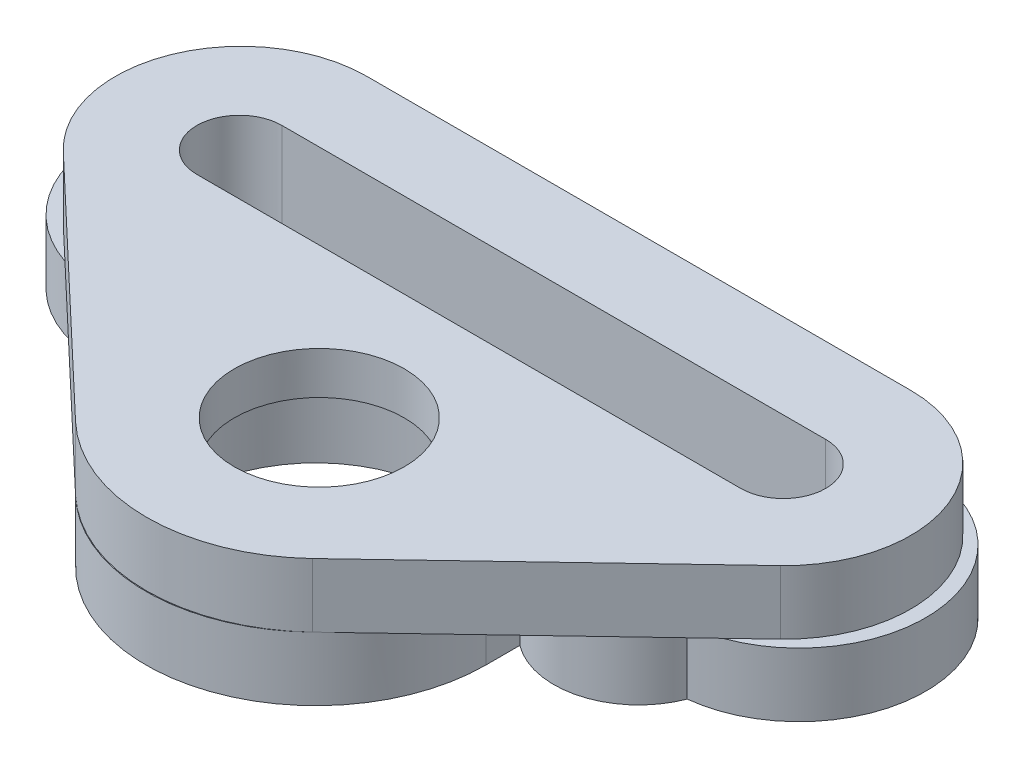
ISO-10303-21;
HEADER;
FILE_DESCRIPTION(('STEP AP214'),'2;1');
FILE_NAME('part.step','',(''),(''),'','','');
FILE_SCHEMA(('AUTOMOTIVE_DESIGN { 1 0 10303 214 1 1 1 1 }'));
ENDSEC;
DATA;
#1=APPLICATION_CONTEXT('core data for automotive mechanical design processes');
#2=APPLICATION_PROTOCOL_DEFINITION('international standard','automotive_design',2000,#1);
#3=PRODUCT_CONTEXT('',#1,'mechanical');
#4=PRODUCT('Part','Part','',(#3));
#5=PRODUCT_RELATED_PRODUCT_CATEGORY('part','',(#4));
#6=PRODUCT_DEFINITION_FORMATION('','',#4);
#7=PRODUCT_DEFINITION_CONTEXT('part definition',#1,'design');
#8=PRODUCT_DEFINITION('design','',#6,#7);
#9=PRODUCT_DEFINITION_SHAPE('','',#8);
#10=(LENGTH_UNIT() NAMED_UNIT(*) SI_UNIT(.MILLI.,.METRE.));
#11=(NAMED_UNIT(*) PLANE_ANGLE_UNIT() SI_UNIT($,.RADIAN.));
#12=(NAMED_UNIT(*) SI_UNIT($,.STERADIAN.) SOLID_ANGLE_UNIT());
#13=UNCERTAINTY_MEASURE_WITH_UNIT(LENGTH_MEASURE(1.E-05),#10,'distance_accuracy_value','');
#14=(GEOMETRIC_REPRESENTATION_CONTEXT(3) GLOBAL_UNCERTAINTY_ASSIGNED_CONTEXT((#13)) GLOBAL_UNIT_ASSIGNED_CONTEXT((#10,
#11,#12)) REPRESENTATION_CONTEXT('',''));
#15=CARTESIAN_POINT('',(0.,0.,0.));
#16=DIRECTION('',(0.,0.,1.));
#17=DIRECTION('',(1.,0.,0.));
#18=AXIS2_PLACEMENT_3D('',#15,#16,#17);
#19=CARTESIAN_POINT('',(0.,7.5,13.8));
#20=DIRECTION('',(0.,-1.,0.));
#21=DIRECTION('',(0.,0.,-1.));
#22=AXIS2_PLACEMENT_3D('',#19,#20,#21);
#23=CYLINDRICAL_SURFACE('',#22,5.);
#24=CARTESIAN_POINT('',(0.,7.5,13.8));
#25=DIRECTION('',(0.,1.,0.));
#26=DIRECTION('',(0.,0.,1.));
#27=AXIS2_PLACEMENT_3D('',#24,#25,#26);
#28=CIRCLE('',#27,5.);
#29=CARTESIAN_POINT('',(0.,7.5,18.8));
#30=VERTEX_POINT('',#29);
#31=EDGE_CURVE('E211',#30,#30,#28,.T.);
#32=ORIENTED_EDGE('',*,*,#31,.T.);
#33=EDGE_LOOP('',(#32));
#34=FACE_BOUND('',#33,.T.);
#35=CARTESIAN_POINT('',(0.,5.,13.8));
#36=DIRECTION('',(0.,-1.,0.));
#37=DIRECTION('',(0.,0.,-1.));
#38=AXIS2_PLACEMENT_3D('',#35,#36,#37);
#39=CIRCLE('',#38,5.);
#40=CARTESIAN_POINT('',(0.,5.,8.8));
#41=VERTEX_POINT('',#40);
#42=EDGE_CURVE('E51',#41,#41,#39,.T.);
#43=ORIENTED_EDGE('',*,*,#42,.T.);
#44=EDGE_LOOP('',(#43));
#45=FACE_BOUND('',#44,.T.);
#46=ADVANCED_FACE('F47',(#34,#45),#23,.F.);
#47=CARTESIAN_POINT('',(16.8301886792453,3.75,2.40566037735848));
#48=DIRECTION('',(0.,-1.,0.));
#49=DIRECTION('',(0.,0.,-1.));
#50=AXIS2_PLACEMENT_3D('',#47,#48,#49);
#51=PLANE('',#50);
#52=CARTESIAN_POINT('',(16.,3.75,2.39999999999999));
#53=DIRECTION('',(0.,1.,0.));
#54=DIRECTION('',(0.,0.,-1.));
#55=AXIS2_PLACEMENT_3D('',#52,#53,#54);
#56=CIRCLE('',#55,7.40000000000001);
#57=CARTESIAN_POINT('',(21.0938170269741,3.75,7.76777682990908));
#58=VERTEX_POINT('',#57);
#59=CARTESIAN_POINT('',(16.,3.75,-5.00000000000001));
#60=VERTEX_POINT('',#59);
#61=EDGE_CURVE('E66',#58,#60,#56,.T.);
#62=ORIENTED_EDGE('',*,*,#61,.F.);
#63=DIRECTION('',(0.725375247285012,0.,-0.688353652293795));
#64=VECTOR('',#63,1.);
#65=CARTESIAN_POINT('',(21.0938170269741,3.75,7.76777682990909));
#66=LINE('',#65,#64);
#67=CARTESIAN_POINT('',(19.3565060078226,3.75,9.41641922524752));
#68=VERTEX_POINT('',#67);
#69=EDGE_CURVE('E11',#68,#58,#66,.T.);
#70=ORIENTED_EDGE('',*,*,#69,.F.);
#71=CARTESIAN_POINT('',(16.8301886792453,3.75,2.40566037735848));
#72=DIRECTION('',(0.,1.,0.));
#73=DIRECTION('',(0.,0.,-1.));
#74=AXIS2_PLACEMENT_3D('',#71,#72,#73);
#75=CIRCLE('',#74,7.45204796468223);
#76=EDGE_CURVE('E301',#68,#60,#75,.T.);
#77=ORIENTED_EDGE('',*,*,#76,.T.);
#78=EDGE_LOOP('',(#62,#70,#77));
#79=FACE_BOUND('',#78,.T.);
#80=ADVANCED_FACE('F436',(#79),#51,.F.);
#81=CARTESIAN_POINT('',(0.,3.75,13.8287972884947));
#82=DIRECTION('',(0.,1.,0.));
#83=DIRECTION('',(0.,0.,1.));
#84=AXIS2_PLACEMENT_3D('',#81,#82,#83);
#85=CIRCLE('',#84,10.1234917773886);
#86=CARTESIAN_POINT('',(-6.9685425389316,3.75,21.1721276399058));
#87=VERTEX_POINT('',#86);
#88=CARTESIAN_POINT('',(6.96854253893163,3.75,21.1721276399058));
#89=VERTEX_POINT('',#88);
#90=EDGE_CURVE('E242',#87,#89,#85,.T.);
#91=ORIENTED_EDGE('',*,*,#90,.F.);
#92=CARTESIAN_POINT('',(0.,3.75,14.));
#93=DIRECTION('',(0.,1.,0.));
#94=DIRECTION('',(0.,0.,1.));
#95=AXIS2_PLACEMENT_3D('',#92,#93,#94);
#96=CIRCLE('',#95,10.);
#97=EDGE_CURVE('E319',#87,#89,#96,.T.);
#98=ORIENTED_EDGE('',*,*,#97,.T.);
#99=EDGE_LOOP('',(#91,#98));
#100=FACE_BOUND('',#99,.T.);
#101=ADVANCED_FACE('F469',(#100),#51,.F.);
#102=CARTESIAN_POINT('',(-16.,3.75,2.4));
#103=DIRECTION('',(0.,1.,0.));
#104=DIRECTION('',(0.,0.,1.));
#105=AXIS2_PLACEMENT_3D('',#102,#103,#104);
#106=CIRCLE('',#105,7.4);
#107=CARTESIAN_POINT('',(-16.,3.75,-5.));
#108=VERTEX_POINT('',#107);
#109=CARTESIAN_POINT('',(-21.0938170269741,3.75,7.76777682990909));
#110=VERTEX_POINT('',#109);
#111=EDGE_CURVE('E215',#108,#110,#106,.T.);
#112=ORIENTED_EDGE('',*,*,#111,.F.);
#113=CARTESIAN_POINT('',(-16.8389748248252,3.75,2.44619310649115));
#114=DIRECTION('',(0.,1.,0.));
#115=DIRECTION('',(0.,0.,1.));
#116=AXIS2_PLACEMENT_3D('',#113,#114,#115);
#117=CIRCLE('',#116,7.4933083838747);
#118=CARTESIAN_POINT('',(-19.2115539058785,3.75,9.55397328317047));
#119=VERTEX_POINT('',#118);
#120=EDGE_CURVE('E302',#108,#119,#117,.T.);
#121=ORIENTED_EDGE('',*,*,#120,.T.);
#122=DIRECTION('',(0.725375247285012,0.,0.688353652293795));
#123=VECTOR('',#122,1.);
#124=CARTESIAN_POINT('',(-21.0938170269741,3.75,7.76777682990909));
#125=LINE('',#124,#123);
#126=EDGE_CURVE('E73',#110,#119,#125,.T.);
#127=ORIENTED_EDGE('',*,*,#126,.F.);
#128=EDGE_LOOP('',(#112,#121,#127));
#129=FACE_BOUND('',#128,.T.);
#130=ADVANCED_FACE('F429',(#129),#51,.F.);
#131=CARTESIAN_POINT('',(16.8301886792453,0.,2.40566037735848));
#132=DIRECTION('',(0.,-1.,0.));
#133=DIRECTION('',(0.,0.,-1.));
#134=AXIS2_PLACEMENT_3D('',#131,#132,#133);
#135=PLANE('',#134);
#136=CARTESIAN_POINT('',(-13.,0.,8.));
#137=DIRECTION('',(0.,-1.,0.));
#138=DIRECTION('',(0.,0.,-1.));
#139=AXIS2_PLACEMENT_3D('',#136,#137,#138);
#140=CIRCLE('',#139,2.5);
#141=CARTESIAN_POINT('',(-13.,0.,5.5));
#142=VERTEX_POINT('',#141);
#143=EDGE_CURVE('E650',#142,#142,#140,.T.);
#144=ORIENTED_EDGE('',*,*,#143,.F.);
#145=EDGE_LOOP('',(#144));
#146=FACE_BOUND('',#145,.T.);
#147=CARTESIAN_POINT('',(13.,0.,8.));
#148=DIRECTION('',(0.,-1.,0.));
#149=DIRECTION('',(0.,0.,-1.));
#150=AXIS2_PLACEMENT_3D('',#147,#148,#149);
#151=CIRCLE('',#150,2.5);
#152=CARTESIAN_POINT('',(13.,0.,5.5));
#153=VERTEX_POINT('',#152);
#154=EDGE_CURVE('E656',#153,#153,#151,.T.);
#155=ORIENTED_EDGE('',*,*,#154,.F.);
#156=EDGE_LOOP('',(#155));
#157=FACE_BOUND('',#156,.T.);
#158=CARTESIAN_POINT('',(0.,0.,14.));
#159=DIRECTION('',(0.,1.,0.));
#160=DIRECTION('',(0.,0.,1.));
#161=AXIS2_PLACEMENT_3D('',#158,#159,#160);
#162=CIRCLE('',#161,7.5);
#163=CARTESIAN_POINT('',(0.,0.,21.5));
#164=VERTEX_POINT('',#163);
#165=EDGE_CURVE('E272',#164,#164,#162,.T.);
#166=ORIENTED_EDGE('',*,*,#165,.T.);
#167=EDGE_LOOP('',(#166));
#168=FACE_BOUND('',#167,.T.);
#169=DIRECTION('',(1.,0.,0.));
#170=VECTOR('',#169,1.);
#171=CARTESIAN_POINT('',(-16.,0.,5.));
#172=LINE('',#171,#170);
#173=CARTESIAN_POINT('',(-16.,0.,5.));
#174=VERTEX_POINT('',#173);
#175=CARTESIAN_POINT('',(16.,0.,4.99999999999999));
#176=VERTEX_POINT('',#175);
#177=EDGE_CURVE('E285',#174,#176,#172,.T.);
#178=ORIENTED_EDGE('',*,*,#177,.T.);
#179=CARTESIAN_POINT('',(16.,0.,2.49999999999999));
#180=DIRECTION('',(0.,1.,0.));
#181=DIRECTION('',(0.,0.,-1.));
#182=AXIS2_PLACEMENT_3D('',#179,#180,#181);
#183=CIRCLE('',#182,2.5);
#184=CARTESIAN_POINT('',(16.,0.,0.));
#185=VERTEX_POINT('',#184);
#186=EDGE_CURVE('E276',#176,#185,#183,.T.);
#187=ORIENTED_EDGE('',*,*,#186,.T.);
#188=DIRECTION('',(-1.,0.,0.));
#189=VECTOR('',#188,1.);
#190=CARTESIAN_POINT('',(-16.,0.,0.));
#191=LINE('',#190,#189);
#192=CARTESIAN_POINT('',(-16.,0.,0.));
#193=VERTEX_POINT('',#192);
#194=EDGE_CURVE('E182',#185,#193,#191,.T.);
#195=ORIENTED_EDGE('',*,*,#194,.T.);
#196=CARTESIAN_POINT('',(-16.,0.,2.5));
#197=DIRECTION('',(0.,1.,0.));
#198=DIRECTION('',(0.,0.,1.));
#199=AXIS2_PLACEMENT_3D('',#196,#197,#198);
#200=CIRCLE('',#199,2.5);
#201=EDGE_CURVE('E281',#193,#174,#200,.T.);
#202=ORIENTED_EDGE('',*,*,#201,.T.);
#203=EDGE_LOOP('',(#178,#187,#195,#202));
#204=FACE_BOUND('',#203,.T.);
#205=CARTESIAN_POINT('',(16.8301886792453,0.,2.40566037735848));
#206=DIRECTION('',(0.,1.,0.));
#207=DIRECTION('',(0.,0.,-1.));
#208=AXIS2_PLACEMENT_3D('',#205,#206,#207);
#209=CIRCLE('',#208,7.45204796468223);
#210=CARTESIAN_POINT('',(17.6603773584906,0.,9.81132075471698));
#211=VERTEX_POINT('',#210);
#212=CARTESIAN_POINT('',(16.,0.,-5.00000000000001));
#213=VERTEX_POINT('',#212);
#214=EDGE_CURVE('E186',#211,#213,#209,.T.);
#215=ORIENTED_EDGE('',*,*,#214,.F.);
#216=CARTESIAN_POINT('',(13.,0.,8.));
#217=DIRECTION('',(0.,1.,0.));
#218=DIRECTION('',(0.,0.,1.));
#219=AXIS2_PLACEMENT_3D('',#216,#217,#218);
#220=CIRCLE('',#219,5.);
#221=CARTESIAN_POINT('',(10.,0.,12.));
#222=VERTEX_POINT('',#221);
#223=EDGE_CURVE('E349',#222,#211,#220,.T.);
#224=ORIENTED_EDGE('',*,*,#223,.F.);
#225=DIRECTION('',(0.,0.,-1.));
#226=VECTOR('',#225,1.);
#227=CARTESIAN_POINT('',(10.,0.,14.));
#228=LINE('',#227,#226);
#229=CARTESIAN_POINT('',(10.,0.,14.));
#230=VERTEX_POINT('',#229);
#231=EDGE_CURVE('E346',#230,#222,#228,.T.);
#232=ORIENTED_EDGE('',*,*,#231,.F.);
#233=CARTESIAN_POINT('',(0.,0.,14.));
#234=DIRECTION('',(0.,1.,0.));
#235=DIRECTION('',(0.,0.,1.));
#236=AXIS2_PLACEMENT_3D('',#233,#234,#235);
#237=CIRCLE('',#236,10.);
#238=CARTESIAN_POINT('',(-10.,0.,14.));
#239=VERTEX_POINT('',#238);
#240=EDGE_CURVE('E343',#239,#230,#237,.T.);
#241=ORIENTED_EDGE('',*,*,#240,.F.);
#242=DIRECTION('',(0.,0.,1.));
#243=VECTOR('',#242,1.);
#244=CARTESIAN_POINT('',(-10.,0.,14.));
#245=LINE('',#244,#243);
#246=CARTESIAN_POINT('',(-10.,0.,12.0576272011794));
#247=VERTEX_POINT('',#246);
#248=EDGE_CURVE('E340',#247,#239,#245,.T.);
#249=ORIENTED_EDGE('',*,*,#248,.F.);
#250=CARTESIAN_POINT('',(-13.,0.,8.));
#251=DIRECTION('',(0.,1.,0.));
#252=DIRECTION('',(0.,0.,1.));
#253=AXIS2_PLACEMENT_3D('',#250,#251,#252);
#254=CIRCLE('',#253,5.04622021950594);
#255=CARTESIAN_POINT('',(-17.6779496496505,0.,9.8923862129823));
#256=VERTEX_POINT('',#255);
#257=EDGE_CURVE('E337',#256,#247,#254,.T.);
#258=ORIENTED_EDGE('',*,*,#257,.F.);
#259=CARTESIAN_POINT('',(-16.8389748248252,0.,2.44619310649115));
#260=DIRECTION('',(0.,1.,0.));
#261=DIRECTION('',(0.,0.,1.));
#262=AXIS2_PLACEMENT_3D('',#259,#260,#261);
#263=CIRCLE('',#262,7.4933083838747);
#264=CARTESIAN_POINT('',(-16.,0.,-5.));
#265=VERTEX_POINT('',#264);
#266=EDGE_CURVE('E334',#265,#256,#263,.T.);
#267=ORIENTED_EDGE('',*,*,#266,.F.);
#268=DIRECTION('',(-1.,0.,0.));
#269=VECTOR('',#268,1.);
#270=CARTESIAN_POINT('',(-16.,0.,-5.));
#271=LINE('',#270,#269);
#272=EDGE_CURVE('E331',#213,#265,#271,.T.);
#273=ORIENTED_EDGE('',*,*,#272,.F.);
#274=EDGE_LOOP('',(#215,#224,#232,#241,#249,#258,#267,#273));
#275=FACE_BOUND('',#274,.T.);
#276=ADVANCED_FACE('F392',(#146,#157,#168,#204,#275),#135,.T.);
#277=CARTESIAN_POINT('',(16.8301886792453,3.75,2.40566037735848));
#278=DIRECTION('',(0.,-1.,0.));
#279=DIRECTION('',(0.,0.,-1.));
#280=AXIS2_PLACEMENT_3D('',#277,#278,#279);
#281=CYLINDRICAL_SURFACE('',#280,7.45204796468223);
#282=ORIENTED_EDGE('',*,*,#214,.T.);
#283=DIRECTION('',(0.,-1.,0.));
#284=VECTOR('',#283,1.);
#285=CARTESIAN_POINT('',(16.,3.75,-5.00000000000001));
#286=LINE('',#285,#284);
#287=EDGE_CURVE('E57',#60,#213,#286,.T.);
#288=ORIENTED_EDGE('',*,*,#287,.F.);
#289=ORIENTED_EDGE('',*,*,#76,.F.);
#290=CARTESIAN_POINT('',(17.6603773584906,3.75,9.81132075471698));
#291=VERTEX_POINT('',#290);
#292=EDGE_CURVE('E296',#291,#68,#75,.T.);
#293=ORIENTED_EDGE('',*,*,#292,.F.);
#294=DIRECTION('',(0.,-1.,0.));
#295=VECTOR('',#294,1.);
#296=CARTESIAN_POINT('',(17.6603773584906,3.75,9.81132075471698));
#297=LINE('',#296,#295);
#298=EDGE_CURVE('E327',#291,#211,#297,.T.);
#299=ORIENTED_EDGE('',*,*,#298,.T.);
#300=EDGE_LOOP('',(#282,#288,#289,#293,#299));
#301=FACE_BOUND('',#300,.T.);
#302=ADVANCED_FACE('F49',(#301),#281,.T.);
#303=CARTESIAN_POINT('',(-16.,3.75,-5.));
#304=DIRECTION('',(0.,0.,1.));
#305=DIRECTION('',(1.,0.,0.));
#306=AXIS2_PLACEMENT_3D('',#303,#304,#305);
#307=PLANE('',#306);
#308=ORIENTED_EDGE('',*,*,#272,.T.);
#309=DIRECTION('',(0.,-1.,0.));
#310=VECTOR('',#309,1.);
#311=CARTESIAN_POINT('',(-16.,3.75,-5.));
#312=LINE('',#311,#310);
#313=EDGE_CURVE('E375',#108,#265,#312,.T.);
#314=ORIENTED_EDGE('',*,*,#313,.F.);
#315=DIRECTION('',(0.,-1.,0.));
#316=VECTOR('',#315,1.);
#317=CARTESIAN_POINT('',(-16.,7.5,-5.));
#318=LINE('',#317,#316);
#319=CARTESIAN_POINT('',(-16.,7.5,-5.));
#320=VERTEX_POINT('',#319);
#321=EDGE_CURVE('E235',#320,#108,#318,.T.);
#322=ORIENTED_EDGE('',*,*,#321,.F.);
#323=DIRECTION('',(-1.,0.,0.));
#324=VECTOR('',#323,1.);
#325=CARTESIAN_POINT('',(-16.,7.5,-5.));
#326=LINE('',#325,#324);
#327=CARTESIAN_POINT('',(16.,7.5,-5.00000000000001));
#328=VERTEX_POINT('',#327);
#329=EDGE_CURVE('E232',#328,#320,#326,.T.);
#330=ORIENTED_EDGE('',*,*,#329,.F.);
#331=DIRECTION('',(0.,-1.,0.));
#332=VECTOR('',#331,1.);
#333=CARTESIAN_POINT('',(16.,7.5,-5.00000000000001));
#334=LINE('',#333,#332);
#335=EDGE_CURVE('E253',#328,#60,#334,.T.);
#336=ORIENTED_EDGE('',*,*,#335,.T.);
#337=ORIENTED_EDGE('',*,*,#287,.T.);
#338=EDGE_LOOP('',(#308,#314,#322,#330,#336,#337));
#339=FACE_BOUND('',#338,.T.);
#340=ADVANCED_FACE('F382',(#339),#307,.F.);
#341=CARTESIAN_POINT('',(-16.8389748248252,3.75,2.44619310649115));
#342=DIRECTION('',(0.,-1.,0.));
#343=DIRECTION('',(0.,0.,-1.));
#344=AXIS2_PLACEMENT_3D('',#341,#342,#343);
#345=CYLINDRICAL_SURFACE('',#344,7.4933083838747);
#346=ORIENTED_EDGE('',*,*,#266,.T.);
#347=DIRECTION('',(0.,-1.,0.));
#348=VECTOR('',#347,1.);
#349=CARTESIAN_POINT('',(-17.6779496496505,3.75,9.8923862129823));
#350=LINE('',#349,#348);
#351=CARTESIAN_POINT('',(-17.6779496496505,3.75,9.8923862129823));
#352=VERTEX_POINT('',#351);
#353=EDGE_CURVE('E371',#352,#256,#350,.T.);
#354=ORIENTED_EDGE('',*,*,#353,.F.);
#355=EDGE_CURVE('E300',#119,#352,#117,.T.);
#356=ORIENTED_EDGE('',*,*,#355,.F.);
#357=ORIENTED_EDGE('',*,*,#120,.F.);
#358=ORIENTED_EDGE('',*,*,#313,.T.);
#359=EDGE_LOOP('',(#346,#354,#356,#357,#358));
#360=FACE_BOUND('',#359,.T.);
#361=ADVANCED_FACE('F398',(#360),#345,.T.);
#362=CARTESIAN_POINT('',(-13.,3.75,8.));
#363=DIRECTION('',(0.,-1.,0.));
#364=DIRECTION('',(0.,0.,-1.));
#365=AXIS2_PLACEMENT_3D('',#362,#363,#364);
#366=CYLINDRICAL_SURFACE('',#365,5.04622021950594);
#367=ORIENTED_EDGE('',*,*,#257,.T.);
#368=DIRECTION('',(0.,-1.,0.));
#369=VECTOR('',#368,1.);
#370=CARTESIAN_POINT('',(-10.,3.75,12.0576272011794));
#371=LINE('',#370,#369);
#372=CARTESIAN_POINT('',(-10.,3.75,12.0576272011794));
#373=VERTEX_POINT('',#372);
#374=EDGE_CURVE('E367',#373,#247,#371,.T.);
#375=ORIENTED_EDGE('',*,*,#374,.F.);
#376=CARTESIAN_POINT('',(-13.,3.75,8.));
#377=DIRECTION('',(0.,1.,0.));
#378=DIRECTION('',(0.,0.,1.));
#379=AXIS2_PLACEMENT_3D('',#376,#377,#378);
#380=CIRCLE('',#379,5.04622021950594);
#381=EDGE_CURVE('E305',#352,#373,#380,.T.);
#382=ORIENTED_EDGE('',*,*,#381,.F.);
#383=ORIENTED_EDGE('',*,*,#353,.T.);
#384=EDGE_LOOP('',(#367,#375,#382,#383));
#385=FACE_BOUND('',#384,.T.);
#386=ADVANCED_FACE('F403',(#385),#366,.T.);
#387=CARTESIAN_POINT('',(-10.,3.75,14.));
#388=DIRECTION('',(1.,0.,0.));
#389=DIRECTION('',(0.,0.,-1.));
#390=AXIS2_PLACEMENT_3D('',#387,#388,#389);
#391=PLANE('',#390);
#392=ORIENTED_EDGE('',*,*,#248,.T.);
#393=DIRECTION('',(0.,-1.,0.));
#394=VECTOR('',#393,1.);
#395=CARTESIAN_POINT('',(-10.,3.75,14.));
#396=LINE('',#395,#394);
#397=CARTESIAN_POINT('',(-10.,3.75,14.));
#398=VERTEX_POINT('',#397);
#399=EDGE_CURVE('E363',#398,#239,#396,.T.);
#400=ORIENTED_EDGE('',*,*,#399,.F.);
#401=DIRECTION('',(0.,0.,1.));
#402=VECTOR('',#401,1.);
#403=CARTESIAN_POINT('',(-10.,3.75,14.));
#404=LINE('',#403,#402);
#405=EDGE_CURVE('E309',#373,#398,#404,.T.);
#406=ORIENTED_EDGE('',*,*,#405,.F.);
#407=ORIENTED_EDGE('',*,*,#374,.T.);
#408=EDGE_LOOP('',(#392,#400,#406,#407));
#409=FACE_BOUND('',#408,.T.);
#410=ADVANCED_FACE('F452',(#409),#391,.F.);
#411=CARTESIAN_POINT('',(0.,3.75,14.));
#412=DIRECTION('',(0.,-1.,0.));
#413=DIRECTION('',(0.,0.,-1.));
#414=AXIS2_PLACEMENT_3D('',#411,#412,#413);
#415=CYLINDRICAL_SURFACE('',#414,10.);
#416=ORIENTED_EDGE('',*,*,#240,.T.);
#417=DIRECTION('',(0.,-1.,0.));
#418=VECTOR('',#417,1.);
#419=CARTESIAN_POINT('',(10.,3.75,14.));
#420=LINE('',#419,#418);
#421=CARTESIAN_POINT('',(10.,3.75,14.));
#422=VERTEX_POINT('',#421);
#423=EDGE_CURVE('E359',#422,#230,#420,.T.);
#424=ORIENTED_EDGE('',*,*,#423,.F.);
#425=EDGE_CURVE('E313',#89,#422,#96,.T.);
#426=ORIENTED_EDGE('',*,*,#425,.F.);
#427=ORIENTED_EDGE('',*,*,#97,.F.);
#428=EDGE_CURVE('E314',#398,#87,#96,.T.);
#429=ORIENTED_EDGE('',*,*,#428,.F.);
#430=ORIENTED_EDGE('',*,*,#399,.T.);
#431=EDGE_LOOP('',(#416,#424,#426,#427,#429,#430));
#432=FACE_BOUND('',#431,.T.);
#433=ADVANCED_FACE('F448',(#432),#415,.T.);
#434=CARTESIAN_POINT('',(10.,3.75,14.));
#435=DIRECTION('',(-1.,0.,0.));
#436=DIRECTION('',(0.,0.,1.));
#437=AXIS2_PLACEMENT_3D('',#434,#435,#436);
#438=PLANE('',#437);
#439=ORIENTED_EDGE('',*,*,#231,.T.);
#440=DIRECTION('',(0.,-1.,0.));
#441=VECTOR('',#440,1.);
#442=CARTESIAN_POINT('',(10.,3.75,12.));
#443=LINE('',#442,#441);
#444=CARTESIAN_POINT('',(10.,3.75,12.));
#445=VERTEX_POINT('',#444);
#446=EDGE_CURVE('E355',#445,#222,#443,.T.);
#447=ORIENTED_EDGE('',*,*,#446,.F.);
#448=DIRECTION('',(0.,0.,-1.));
#449=VECTOR('',#448,1.);
#450=CARTESIAN_POINT('',(10.,3.75,14.));
#451=LINE('',#450,#449);
#452=EDGE_CURVE('E318',#422,#445,#451,.T.);
#453=ORIENTED_EDGE('',*,*,#452,.F.);
#454=ORIENTED_EDGE('',*,*,#423,.T.);
#455=EDGE_LOOP('',(#439,#447,#453,#454));
#456=FACE_BOUND('',#455,.T.);
#457=ADVANCED_FACE('F445',(#456),#438,.F.);
#458=CARTESIAN_POINT('',(13.,3.75,8.));
#459=DIRECTION('',(0.,-1.,0.));
#460=DIRECTION('',(0.,0.,-1.));
#461=AXIS2_PLACEMENT_3D('',#458,#459,#460);
#462=CYLINDRICAL_SURFACE('',#461,5.);
#463=ORIENTED_EDGE('',*,*,#223,.T.);
#464=ORIENTED_EDGE('',*,*,#298,.F.);
#465=CARTESIAN_POINT('',(13.,3.75,8.));
#466=DIRECTION('',(0.,1.,0.));
#467=DIRECTION('',(0.,0.,1.));
#468=AXIS2_PLACEMENT_3D('',#465,#466,#467);
#469=CIRCLE('',#468,5.);
#470=EDGE_CURVE('E323',#445,#291,#469,.T.);
#471=ORIENTED_EDGE('',*,*,#470,.F.);
#472=ORIENTED_EDGE('',*,*,#446,.T.);
#473=EDGE_LOOP('',(#463,#464,#471,#472));
#474=FACE_BOUND('',#473,.T.);
#475=ADVANCED_FACE('F443',(#474),#462,.T.);
#476=CARTESIAN_POINT('',(16.,3.75,2.49999999999999));
#477=DIRECTION('',(0.,-1.,0.));
#478=DIRECTION('',(0.,0.,-1.));
#479=AXIS2_PLACEMENT_3D('',#476,#477,#478);
#480=CYLINDRICAL_SURFACE('',#479,2.5);
#481=ORIENTED_EDGE('',*,*,#186,.F.);
#482=DIRECTION('',(0.,-1.,0.));
#483=VECTOR('',#482,1.);
#484=CARTESIAN_POINT('',(16.,3.75,4.99999999999999));
#485=LINE('',#484,#483);
#486=CARTESIAN_POINT('',(16.,7.5,4.99999999999999));
#487=VERTEX_POINT('',#486);
#488=EDGE_CURVE('E193',#487,#176,#485,.T.);
#489=ORIENTED_EDGE('',*,*,#488,.F.);
#490=CARTESIAN_POINT('',(16.,7.5,2.5));
#491=DIRECTION('',(0.,1.,0.));
#492=DIRECTION('',(0.,0.,-1.));
#493=AXIS2_PLACEMENT_3D('',#490,#491,#492);
#494=CIRCLE('',#493,2.5);
#495=CARTESIAN_POINT('',(16.,7.5,0.));
#496=VERTEX_POINT('',#495);
#497=EDGE_CURVE('E190',#487,#496,#494,.T.);
#498=ORIENTED_EDGE('',*,*,#497,.T.);
#499=DIRECTION('',(0.,-1.,0.));
#500=VECTOR('',#499,1.);
#501=CARTESIAN_POINT('',(16.,3.75,0.));
#502=LINE('',#501,#500);
#503=EDGE_CURVE('E175',#496,#185,#502,.T.);
#504=ORIENTED_EDGE('',*,*,#503,.T.);
#505=EDGE_LOOP('',(#481,#489,#498,#504));
#506=FACE_BOUND('',#505,.T.);
#507=ADVANCED_FACE('F191',(#506),#480,.F.);
#508=CARTESIAN_POINT('',(-16.,3.75,0.));
#509=DIRECTION('',(0.,0.,1.));
#510=DIRECTION('',(1.,0.,0.));
#511=AXIS2_PLACEMENT_3D('',#508,#509,#510);
#512=PLANE('',#511);
#513=ORIENTED_EDGE('',*,*,#194,.F.);
#514=ORIENTED_EDGE('',*,*,#503,.F.);
#515=DIRECTION('',(-1.,0.,0.));
#516=VECTOR('',#515,1.);
#517=CARTESIAN_POINT('',(-16.,7.5,0.));
#518=LINE('',#517,#516);
#519=CARTESIAN_POINT('',(-16.,7.5,0.));
#520=VERTEX_POINT('',#519);
#521=EDGE_CURVE('E179',#496,#520,#518,.T.);
#522=ORIENTED_EDGE('',*,*,#521,.T.);
#523=DIRECTION('',(0.,-1.,0.));
#524=VECTOR('',#523,1.);
#525=CARTESIAN_POINT('',(-16.,3.75,0.));
#526=LINE('',#525,#524);
#527=EDGE_CURVE('E187',#520,#193,#526,.T.);
#528=ORIENTED_EDGE('',*,*,#527,.T.);
#529=EDGE_LOOP('',(#513,#514,#522,#528));
#530=FACE_BOUND('',#529,.T.);
#531=ADVANCED_FACE('F177',(#530),#512,.T.);
#532=CARTESIAN_POINT('',(-16.,3.75,2.5));
#533=DIRECTION('',(0.,-1.,0.));
#534=DIRECTION('',(0.,0.,-1.));
#535=AXIS2_PLACEMENT_3D('',#532,#533,#534);
#536=CYLINDRICAL_SURFACE('',#535,2.5);
#537=ORIENTED_EDGE('',*,*,#201,.F.);
#538=ORIENTED_EDGE('',*,*,#527,.F.);
#539=CARTESIAN_POINT('',(-16.,7.5,2.5));
#540=DIRECTION('',(0.,1.,0.));
#541=DIRECTION('',(0.,0.,1.));
#542=AXIS2_PLACEMENT_3D('',#539,#540,#541);
#543=CIRCLE('',#542,2.5);
#544=CARTESIAN_POINT('',(-16.,7.5,5.));
#545=VERTEX_POINT('',#544);
#546=EDGE_CURVE('E201',#520,#545,#543,.T.);
#547=ORIENTED_EDGE('',*,*,#546,.T.);
#548=DIRECTION('',(0.,-1.,0.));
#549=VECTOR('',#548,1.);
#550=CARTESIAN_POINT('',(-16.,3.75,5.));
#551=LINE('',#550,#549);
#552=EDGE_CURVE('E291',#545,#174,#551,.T.);
#553=ORIENTED_EDGE('',*,*,#552,.T.);
#554=EDGE_LOOP('',(#537,#538,#547,#553));
#555=FACE_BOUND('',#554,.T.);
#556=ADVANCED_FACE('F495',(#555),#536,.F.);
#557=CARTESIAN_POINT('',(-16.,3.75,5.));
#558=DIRECTION('',(0.,0.,-1.));
#559=DIRECTION('',(-1.,0.,0.));
#560=AXIS2_PLACEMENT_3D('',#557,#558,#559);
#561=PLANE('',#560);
#562=ORIENTED_EDGE('',*,*,#177,.F.);
#563=ORIENTED_EDGE('',*,*,#552,.F.);
#564=DIRECTION('',(1.,0.,0.));
#565=VECTOR('',#564,1.);
#566=CARTESIAN_POINT('',(-16.,7.5,5.));
#567=LINE('',#566,#565);
#568=EDGE_CURVE('E205',#545,#487,#567,.T.);
#569=ORIENTED_EDGE('',*,*,#568,.T.);
#570=ORIENTED_EDGE('',*,*,#488,.T.);
#571=EDGE_LOOP('',(#562,#563,#569,#570));
#572=FACE_BOUND('',#571,.T.);
#573=ADVANCED_FACE('F491',(#572),#561,.T.);
#574=CARTESIAN_POINT('',(0.,3.75,14.));
#575=DIRECTION('',(0.,-1.,0.));
#576=DIRECTION('',(0.,0.,-1.));
#577=AXIS2_PLACEMENT_3D('',#574,#575,#576);
#578=CYLINDRICAL_SURFACE('',#577,7.5);
#579=ORIENTED_EDGE('',*,*,#165,.F.);
#580=EDGE_LOOP('',(#579));
#581=FACE_BOUND('',#580,.T.);
#582=CARTESIAN_POINT('',(0.,5.,14.));
#583=DIRECTION('',(0.,-1.,0.));
#584=DIRECTION('',(0.,0.,-1.));
#585=AXIS2_PLACEMENT_3D('',#582,#583,#584);
#586=CIRCLE('',#585,7.5);
#587=CARTESIAN_POINT('',(0.,5.,6.5));
#588=VERTEX_POINT('',#587);
#589=EDGE_CURVE('E649',#588,#588,#586,.T.);
#590=ORIENTED_EDGE('',*,*,#589,.F.);
#591=EDGE_LOOP('',(#590));
#592=FACE_BOUND('',#591,.T.);
#593=ADVANCED_FACE('F481',(#581,#592),#578,.F.);
#594=CARTESIAN_POINT('',(16.,7.5,2.39999999999999));
#595=DIRECTION('',(0.,-1.,0.));
#596=DIRECTION('',(0.,0.,-1.));
#597=AXIS2_PLACEMENT_3D('',#594,#595,#596);
#598=CYLINDRICAL_SURFACE('',#597,7.40000000000001);
#599=ORIENTED_EDGE('',*,*,#61,.T.);
#600=ORIENTED_EDGE('',*,*,#335,.F.);
#601=CARTESIAN_POINT('',(16.,7.5,2.39999999999999));
#602=DIRECTION('',(0.,1.,0.));
#603=DIRECTION('',(0.,0.,-1.));
#604=AXIS2_PLACEMENT_3D('',#601,#602,#603);
#605=CIRCLE('',#604,7.40000000000001);
#606=CARTESIAN_POINT('',(21.0938170269741,7.5,7.76777682990908));
#607=VERTEX_POINT('',#606);
#608=EDGE_CURVE('E229',#607,#328,#605,.T.);
#609=ORIENTED_EDGE('',*,*,#608,.F.);
#610=DIRECTION('',(0.,-1.,0.));
#611=VECTOR('',#610,1.);
#612=CARTESIAN_POINT('',(21.0938170269741,7.5,7.76777682990908));
#613=LINE('',#612,#611);
#614=EDGE_CURVE('E257',#607,#58,#613,.T.);
#615=ORIENTED_EDGE('',*,*,#614,.T.);
#616=EDGE_LOOP('',(#599,#600,#609,#615));
#617=FACE_BOUND('',#616,.T.);
#618=ADVANCED_FACE('F432',(#617),#598,.T.);
#619=CARTESIAN_POINT('',(21.0938170269741,7.5,7.76777682990909));
#620=DIRECTION('',(-0.688353652293795,0.,-0.725375247285012));
#621=DIRECTION('',(-0.725375247285012,0.,0.688353652293795));
#622=AXIS2_PLACEMENT_3D('',#619,#620,#621);
#623=PLANE('',#622);
#624=EDGE_CURVE('E59',#89,#68,#66,.T.);
#625=ORIENTED_EDGE('',*,*,#624,.T.);
#626=ORIENTED_EDGE('',*,*,#69,.T.);
#627=ORIENTED_EDGE('',*,*,#614,.F.);
#628=DIRECTION('',(0.725375247285012,0.,-0.688353652293795));
#629=VECTOR('',#628,1.);
#630=CARTESIAN_POINT('',(21.0938170269741,7.5,7.76777682990909));
#631=LINE('',#630,#629);
#632=CARTESIAN_POINT('',(6.96854253893167,7.5,21.1721276399057));
#633=VERTEX_POINT('',#632);
#634=EDGE_CURVE('E226',#633,#607,#631,.T.);
#635=ORIENTED_EDGE('',*,*,#634,.F.);
#636=DIRECTION('',(0.,-1.,0.));
#637=VECTOR('',#636,1.);
#638=CARTESIAN_POINT('',(6.96854253893167,7.5,21.1721276399057));
#639=LINE('',#638,#637);
#640=EDGE_CURVE('E261',#633,#89,#639,.T.);
#641=ORIENTED_EDGE('',*,*,#640,.T.);
#642=EDGE_LOOP('',(#625,#626,#627,#635,#641));
#643=FACE_BOUND('',#642,.T.);
#644=ADVANCED_FACE('F434',(#643),#623,.F.);
#645=CARTESIAN_POINT('',(0.,7.5,13.8287972884947));
#646=DIRECTION('',(0.,-1.,0.));
#647=DIRECTION('',(0.,0.,-1.));
#648=AXIS2_PLACEMENT_3D('',#645,#646,#647);
#649=CYLINDRICAL_SURFACE('',#648,10.1234917773886);
#650=ORIENTED_EDGE('',*,*,#90,.T.);
#651=ORIENTED_EDGE('',*,*,#640,.F.);
#652=CARTESIAN_POINT('',(0.,7.5,13.8287972884947));
#653=DIRECTION('',(0.,1.,0.));
#654=DIRECTION('',(0.,0.,1.));
#655=AXIS2_PLACEMENT_3D('',#652,#653,#654);
#656=CIRCLE('',#655,10.1234917773886);
#657=CARTESIAN_POINT('',(-6.96854253893166,7.5,21.1721276399057));
#658=VERTEX_POINT('',#657);
#659=EDGE_CURVE('E223',#658,#633,#656,.T.);
#660=ORIENTED_EDGE('',*,*,#659,.F.);
#661=DIRECTION('',(0.,-1.,0.));
#662=VECTOR('',#661,1.);
#663=CARTESIAN_POINT('',(-6.96854253893166,7.5,21.1721276399057));
#664=LINE('',#663,#662);
#665=EDGE_CURVE('E265',#658,#87,#664,.T.);
#666=ORIENTED_EDGE('',*,*,#665,.T.);
#667=EDGE_LOOP('',(#650,#651,#660,#666));
#668=FACE_BOUND('',#667,.T.);
#669=ADVANCED_FACE('F418',(#668),#649,.T.);
#670=CARTESIAN_POINT('',(-21.0938170269741,7.5,7.76777682990909));
#671=DIRECTION('',(0.688353652293795,0.,-0.725375247285012));
#672=DIRECTION('',(-0.725375247285012,0.,-0.688353652293796));
#673=AXIS2_PLACEMENT_3D('',#670,#671,#672);
#674=PLANE('',#673);
#675=ORIENTED_EDGE('',*,*,#126,.T.);
#676=EDGE_CURVE('E239',#119,#87,#125,.T.);
#677=ORIENTED_EDGE('',*,*,#676,.T.);
#678=ORIENTED_EDGE('',*,*,#665,.F.);
#679=DIRECTION('',(0.725375247285012,0.,0.688353652293795));
#680=VECTOR('',#679,1.);
#681=CARTESIAN_POINT('',(-21.0938170269741,7.5,7.76777682990909));
#682=LINE('',#681,#680);
#683=CARTESIAN_POINT('',(-21.0938170269741,7.5,7.76777682990909));
#684=VERTEX_POINT('',#683);
#685=EDGE_CURVE('E220',#684,#658,#682,.T.);
#686=ORIENTED_EDGE('',*,*,#685,.F.);
#687=DIRECTION('',(0.,-1.,0.));
#688=VECTOR('',#687,1.);
#689=CARTESIAN_POINT('',(-21.0938170269741,7.5,7.76777682990909));
#690=LINE('',#689,#688);
#691=EDGE_CURVE('E269',#684,#110,#690,.T.);
#692=ORIENTED_EDGE('',*,*,#691,.T.);
#693=EDGE_LOOP('',(#675,#677,#678,#686,#692));
#694=FACE_BOUND('',#693,.T.);
#695=ADVANCED_FACE('F415',(#694),#674,.F.);
#696=CARTESIAN_POINT('',(-16.,7.5,2.4));
#697=DIRECTION('',(0.,-1.,0.));
#698=DIRECTION('',(0.,0.,-1.));
#699=AXIS2_PLACEMENT_3D('',#696,#697,#698);
#700=CYLINDRICAL_SURFACE('',#699,7.4);
#701=ORIENTED_EDGE('',*,*,#111,.T.);
#702=ORIENTED_EDGE('',*,*,#691,.F.);
#703=CARTESIAN_POINT('',(-16.,7.5,2.4));
#704=DIRECTION('',(0.,1.,0.));
#705=DIRECTION('',(0.,0.,1.));
#706=AXIS2_PLACEMENT_3D('',#703,#704,#705);
#707=CIRCLE('',#706,7.4);
#708=EDGE_CURVE('E216',#320,#684,#707,.T.);
#709=ORIENTED_EDGE('',*,*,#708,.F.);
#710=ORIENTED_EDGE('',*,*,#321,.T.);
#711=EDGE_LOOP('',(#701,#702,#709,#710));
#712=FACE_BOUND('',#711,.T.);
#713=ADVANCED_FACE('F427',(#712),#700,.T.);
#714=CARTESIAN_POINT('',(-16.,7.5,2.4));
#715=DIRECTION('',(0.,1.,0.));
#716=DIRECTION('',(0.,0.,1.));
#717=AXIS2_PLACEMENT_3D('',#714,#715,#716);
#718=PLANE('',#717);
#719=ORIENTED_EDGE('',*,*,#708,.T.);
#720=ORIENTED_EDGE('',*,*,#685,.T.);
#721=ORIENTED_EDGE('',*,*,#659,.T.);
#722=ORIENTED_EDGE('',*,*,#634,.T.);
#723=ORIENTED_EDGE('',*,*,#608,.T.);
#724=ORIENTED_EDGE('',*,*,#329,.T.);
#725=EDGE_LOOP('',(#719,#720,#721,#722,#723,#724));
#726=FACE_BOUND('',#725,.T.);
#727=ORIENTED_EDGE('',*,*,#31,.F.);
#728=EDGE_LOOP('',(#727));
#729=FACE_BOUND('',#728,.T.);
#730=ORIENTED_EDGE('',*,*,#521,.F.);
#731=ORIENTED_EDGE('',*,*,#497,.F.);
#732=ORIENTED_EDGE('',*,*,#568,.F.);
#733=ORIENTED_EDGE('',*,*,#546,.F.);
#734=EDGE_LOOP('',(#730,#731,#732,#733));
#735=FACE_BOUND('',#734,.T.);
#736=ADVANCED_FACE('F199',(#726,#729,#735),#718,.T.);
#737=CARTESIAN_POINT('',(-16.,3.75,2.4));
#738=DIRECTION('',(0.,1.,0.));
#739=DIRECTION('',(0.,0.,1.));
#740=AXIS2_PLACEMENT_3D('',#737,#738,#739);
#741=PLANE('',#740);
#742=ORIENTED_EDGE('',*,*,#470,.T.);
#743=ORIENTED_EDGE('',*,*,#292,.T.);
#744=ORIENTED_EDGE('',*,*,#624,.F.);
#745=ORIENTED_EDGE('',*,*,#425,.T.);
#746=ORIENTED_EDGE('',*,*,#452,.T.);
#747=EDGE_LOOP('',(#742,#743,#744,#745,#746));
#748=FACE_BOUND('',#747,.T.);
#749=ADVANCED_FACE('F438',(#748),#741,.F.);
#750=ORIENTED_EDGE('',*,*,#676,.F.);
#751=ORIENTED_EDGE('',*,*,#355,.T.);
#752=ORIENTED_EDGE('',*,*,#381,.T.);
#753=ORIENTED_EDGE('',*,*,#405,.T.);
#754=ORIENTED_EDGE('',*,*,#428,.T.);
#755=EDGE_LOOP('',(#750,#751,#752,#753,#754));
#756=FACE_BOUND('',#755,.T.);
#757=ADVANCED_FACE('F408',(#756),#741,.F.);
#758=CARTESIAN_POINT('',(0.,5.,14.));
#759=DIRECTION('',(0.,-1.,0.));
#760=DIRECTION('',(0.,0.,-1.));
#761=AXIS2_PLACEMENT_3D('',#758,#759,#760);
#762=PLANE('',#761);
#763=ORIENTED_EDGE('',*,*,#42,.F.);
#764=EDGE_LOOP('',(#763));
#765=FACE_BOUND('',#764,.T.);
#766=ORIENTED_EDGE('',*,*,#589,.T.);
#767=EDGE_LOOP('',(#766));
#768=FACE_BOUND('',#767,.T.);
#769=ADVANCED_FACE('F474',(#765,#768),#762,.T.);
#770=CARTESIAN_POINT('',(13.,6.5,8.));
#771=DIRECTION('',(0.,-1.,0.));
#772=DIRECTION('',(0.,0.,-1.));
#773=AXIS2_PLACEMENT_3D('',#770,#771,#772);
#774=CYLINDRICAL_SURFACE('',#773,2.5);
#775=CARTESIAN_POINT('',(13.,6.5,8.));
#776=DIRECTION('',(0.,-1.,0.));
#777=DIRECTION('',(0.,0.,-1.));
#778=AXIS2_PLACEMENT_3D('',#775,#776,#777);
#779=CIRCLE('',#778,2.5);
#780=CARTESIAN_POINT('',(13.,6.5,5.5));
#781=VERTEX_POINT('',#780);
#782=EDGE_CURVE('E662',#781,#781,#779,.T.);
#783=CARTESIAN_POINT('',(13.,6.5,5.5));
#784=CARTESIAN_POINT('',(13.,6.43229166666667,5.5));
#785=CARTESIAN_POINT('',(13.,6.36458333333333,5.5));
#786=CARTESIAN_POINT('',(13.,6.22916666666667,5.5));
#787=CARTESIAN_POINT('',(13.,6.16145833333333,5.5));
#788=CARTESIAN_POINT('',(13.,6.02604166666667,5.5));
#789=CARTESIAN_POINT('',(13.,5.95833333333333,5.5));
#790=CARTESIAN_POINT('',(13.,5.82291666666667,5.5));
#791=CARTESIAN_POINT('',(13.,5.75520833333333,5.5));
#792=CARTESIAN_POINT('',(13.,5.61979166666667,5.5));
#793=CARTESIAN_POINT('',(13.,5.55208333333333,5.5));
#794=CARTESIAN_POINT('',(13.,5.41666666666667,5.5));
#795=CARTESIAN_POINT('',(13.,5.34895833333333,5.5));
#796=CARTESIAN_POINT('',(13.,5.21354166666667,5.5));
#797=CARTESIAN_POINT('',(13.,5.14583333333333,5.5));
#798=CARTESIAN_POINT('',(13.,5.01041666666667,5.5));
#799=CARTESIAN_POINT('',(13.,4.94270833333333,5.5));
#800=CARTESIAN_POINT('',(13.,4.80729166666667,5.5));
#801=CARTESIAN_POINT('',(13.,4.73958333333333,5.5));
#802=CARTESIAN_POINT('',(13.,4.60416666666667,5.5));
#803=CARTESIAN_POINT('',(13.,4.53645833333333,5.5));
#804=CARTESIAN_POINT('',(13.,4.40104166666667,5.5));
#805=CARTESIAN_POINT('',(13.,4.33333333333333,5.5));
#806=CARTESIAN_POINT('',(13.,4.19791666666667,5.5));
#807=CARTESIAN_POINT('',(13.,4.13020833333333,5.5));
#808=CARTESIAN_POINT('',(13.,3.99479166666667,5.5));
#809=CARTESIAN_POINT('',(13.,3.92708333333333,5.5));
#810=CARTESIAN_POINT('',(13.,3.79166666666667,5.5));
#811=CARTESIAN_POINT('',(13.,3.72395833333333,5.5));
#812=CARTESIAN_POINT('',(13.,3.58854166666667,5.5));
#813=CARTESIAN_POINT('',(13.,3.52083333333333,5.5));
#814=CARTESIAN_POINT('',(13.,3.38541666666667,5.5));
#815=CARTESIAN_POINT('',(13.,3.31770833333333,5.5));
#816=CARTESIAN_POINT('',(13.,3.18229166666667,5.5));
#817=CARTESIAN_POINT('',(13.,3.11458333333333,5.5));
#818=CARTESIAN_POINT('',(13.,2.97916666666667,5.5));
#819=CARTESIAN_POINT('',(13.,2.91145833333333,5.5));
#820=CARTESIAN_POINT('',(13.,2.77604166666667,5.5));
#821=CARTESIAN_POINT('',(13.,2.70833333333333,5.5));
#822=CARTESIAN_POINT('',(13.,2.57291666666667,5.5));
#823=CARTESIAN_POINT('',(13.,2.50520833333333,5.5));
#824=CARTESIAN_POINT('',(13.,2.36979166666667,5.5));
#825=CARTESIAN_POINT('',(13.,2.30208333333333,5.5));
#826=CARTESIAN_POINT('',(13.,2.16666666666667,5.5));
#827=CARTESIAN_POINT('',(13.,2.09895833333333,5.5));
#828=CARTESIAN_POINT('',(13.,1.96354166666667,5.5));
#829=CARTESIAN_POINT('',(13.,1.89583333333333,5.5));
#830=CARTESIAN_POINT('',(13.,1.76041666666667,5.5));
#831=CARTESIAN_POINT('',(13.,1.69270833333333,5.5));
#832=CARTESIAN_POINT('',(13.,1.55729166666667,5.5));
#833=CARTESIAN_POINT('',(13.,1.48958333333333,5.5));
#834=CARTESIAN_POINT('',(13.,1.35416666666667,5.5));
#835=CARTESIAN_POINT('',(13.,1.28645833333333,5.5));
#836=CARTESIAN_POINT('',(13.,1.15104166666667,5.5));
#837=CARTESIAN_POINT('',(13.,1.08333333333333,5.5));
#838=CARTESIAN_POINT('',(13.,0.947916666666667,5.5));
#839=CARTESIAN_POINT('',(13.,0.880208333333333,5.5));
#840=CARTESIAN_POINT('',(13.,0.744791666666667,5.5));
#841=CARTESIAN_POINT('',(13.,0.677083333333333,5.5));
#842=CARTESIAN_POINT('',(13.,0.541666666666667,5.5));
#843=CARTESIAN_POINT('',(13.,0.473958333333333,5.5));
#844=CARTESIAN_POINT('',(13.,0.338541666666667,5.5));
#845=CARTESIAN_POINT('',(13.,0.270833333333334,5.5));
#846=CARTESIAN_POINT('',(13.,0.135416666666667,5.5));
#847=CARTESIAN_POINT('',(13.,0.0677083333333334,5.5));
#848=CARTESIAN_POINT('',(13.,0.,5.5));
#849=B_SPLINE_CURVE_WITH_KNOTS('',3,(#783,#784,#785,#786,#787,#788,#789,#790,#791,#792,#793,
#794,#795,#796,#797,#798,#799,#800,#801,#802,#803,#804,#805,#806,#807,#808,#809,#810,#811,#812,
#813,#814,#815,#816,#817,#818,#819,#820,#821,#822,#823,#824,#825,#826,#827,#828,#829,#830,#831,
#832,#833,#834,#835,#836,#837,#838,#839,#840,#841,#842,#843,#844,#845,#846,#847,#848),
.UNSPECIFIED.,.F.,.F.,(4,2,2,2,2,2,2,2,2,2,2,2,2,2,2,2,2,2,2,2,2,2,2,2,2,2,2,2,2,2,2,2,4),(0.,
0.203124999999999,0.40625,0.609375,0.8125,1.015625,1.21875,1.421875,1.625,1.828125,2.03125,
2.234375,2.4375,2.640625,2.84375,3.046875,3.25,3.453125,3.65625,3.859375,4.0625,4.265625,
4.46875,4.671875,4.875,5.078125,5.28125,5.484375,5.6875,5.890625,6.09375,6.296875,6.5),.UNSPECIFIED.);
#850=EDGE_CURVE('BSEAM604',#781,#153,#849,.T.);
#851=ORIENTED_EDGE('',*,*,#782,.F.);
#852=ORIENTED_EDGE('',*,*,#154,.T.);
#853=ORIENTED_EDGE('',*,*,#850,.T.);
#854=ORIENTED_EDGE('',*,*,#850,.F.);
#855=EDGE_LOOP('',(#851,#853,#852,#854));
#856=FACE_BOUND('',#855,.T.);
#857=ADVANCED_FACE('F604',(#856),#774,.F.);
#858=CARTESIAN_POINT('',(13.,6.5,8.));
#859=DIRECTION('',(0.,-1.,0.));
#860=DIRECTION('',(0.,0.,-1.));
#861=AXIS2_PLACEMENT_3D('',#858,#859,#860);
#862=PLANE('',#861);
#863=ORIENTED_EDGE('',*,*,#782,.T.);
#864=EDGE_LOOP('',(#863));
#865=FACE_BOUND('',#864,.T.);
#866=ADVANCED_FACE('F613',(#865),#862,.T.);
#867=CARTESIAN_POINT('',(-13.,6.5,8.));
#868=DIRECTION('',(0.,-1.,0.));
#869=DIRECTION('',(0.,0.,-1.));
#870=AXIS2_PLACEMENT_3D('',#867,#868,#869);
#871=CYLINDRICAL_SURFACE('',#870,2.5);
#872=CARTESIAN_POINT('',(-13.,6.5,8.));
#873=DIRECTION('',(0.,-1.,0.));
#874=DIRECTION('',(0.,0.,-1.));
#875=AXIS2_PLACEMENT_3D('',#872,#873,#874);
#876=CIRCLE('',#875,2.5);
#877=CARTESIAN_POINT('',(-13.,6.5,5.5));
#878=VERTEX_POINT('',#877);
#879=EDGE_CURVE('E647',#878,#878,#876,.T.);
#880=CARTESIAN_POINT('',(-13.,6.5,5.5));
#881=CARTESIAN_POINT('',(-13.,6.43229166666667,5.5));
#882=CARTESIAN_POINT('',(-13.,6.36458333333333,5.5));
#883=CARTESIAN_POINT('',(-13.,6.22916666666667,5.5));
#884=CARTESIAN_POINT('',(-13.,6.16145833333333,5.5));
#885=CARTESIAN_POINT('',(-13.,6.02604166666667,5.5));
#886=CARTESIAN_POINT('',(-13.,5.95833333333333,5.5));
#887=CARTESIAN_POINT('',(-13.,5.82291666666667,5.5));
#888=CARTESIAN_POINT('',(-13.,5.75520833333333,5.5));
#889=CARTESIAN_POINT('',(-13.,5.61979166666667,5.5));
#890=CARTESIAN_POINT('',(-13.,5.55208333333333,5.5));
#891=CARTESIAN_POINT('',(-13.,5.41666666666667,5.5));
#892=CARTESIAN_POINT('',(-13.,5.34895833333333,5.5));
#893=CARTESIAN_POINT('',(-13.,5.21354166666667,5.5));
#894=CARTESIAN_POINT('',(-13.,5.14583333333333,5.5));
#895=CARTESIAN_POINT('',(-13.,5.01041666666667,5.5));
#896=CARTESIAN_POINT('',(-13.,4.94270833333333,5.5));
#897=CARTESIAN_POINT('',(-13.,4.80729166666667,5.5));
#898=CARTESIAN_POINT('',(-13.,4.73958333333333,5.5));
#899=CARTESIAN_POINT('',(-13.,4.60416666666667,5.5));
#900=CARTESIAN_POINT('',(-13.,4.53645833333333,5.5));
#901=CARTESIAN_POINT('',(-13.,4.40104166666667,5.5));
#902=CARTESIAN_POINT('',(-13.,4.33333333333333,5.5));
#903=CARTESIAN_POINT('',(-13.,4.19791666666667,5.5));
#904=CARTESIAN_POINT('',(-13.,4.13020833333333,5.5));
#905=CARTESIAN_POINT('',(-13.,3.99479166666667,5.5));
#906=CARTESIAN_POINT('',(-13.,3.92708333333333,5.5));
#907=CARTESIAN_POINT('',(-13.,3.79166666666667,5.5));
#908=CARTESIAN_POINT('',(-13.,3.72395833333333,5.5));
#909=CARTESIAN_POINT('',(-13.,3.58854166666667,5.5));
#910=CARTESIAN_POINT('',(-13.,3.52083333333333,5.5));
#911=CARTESIAN_POINT('',(-13.,3.38541666666667,5.5));
#912=CARTESIAN_POINT('',(-13.,3.31770833333333,5.5));
#913=CARTESIAN_POINT('',(-13.,3.18229166666667,5.5));
#914=CARTESIAN_POINT('',(-13.,3.11458333333333,5.5));
#915=CARTESIAN_POINT('',(-13.,2.97916666666667,5.5));
#916=CARTESIAN_POINT('',(-13.,2.91145833333333,5.5));
#917=CARTESIAN_POINT('',(-13.,2.77604166666667,5.5));
#918=CARTESIAN_POINT('',(-13.,2.70833333333333,5.5));
#919=CARTESIAN_POINT('',(-13.,2.57291666666667,5.5));
#920=CARTESIAN_POINT('',(-13.,2.50520833333333,5.5));
#921=CARTESIAN_POINT('',(-13.,2.36979166666667,5.5));
#922=CARTESIAN_POINT('',(-13.,2.30208333333333,5.5));
#923=CARTESIAN_POINT('',(-13.,2.16666666666667,5.5));
#924=CARTESIAN_POINT('',(-13.,2.09895833333333,5.5));
#925=CARTESIAN_POINT('',(-13.,1.96354166666667,5.5));
#926=CARTESIAN_POINT('',(-13.,1.89583333333333,5.5));
#927=CARTESIAN_POINT('',(-13.,1.76041666666667,5.5));
#928=CARTESIAN_POINT('',(-13.,1.69270833333333,5.5));
#929=CARTESIAN_POINT('',(-13.,1.55729166666667,5.5));
#930=CARTESIAN_POINT('',(-13.,1.48958333333333,5.5));
#931=CARTESIAN_POINT('',(-13.,1.35416666666667,5.5));
#932=CARTESIAN_POINT('',(-13.,1.28645833333333,5.5));
#933=CARTESIAN_POINT('',(-13.,1.15104166666667,5.5));
#934=CARTESIAN_POINT('',(-13.,1.08333333333333,5.5));
#935=CARTESIAN_POINT('',(-13.,0.947916666666667,5.5));
#936=CARTESIAN_POINT('',(-13.,0.880208333333333,5.5));
#937=CARTESIAN_POINT('',(-13.,0.744791666666667,5.5));
#938=CARTESIAN_POINT('',(-13.,0.677083333333333,5.5));
#939=CARTESIAN_POINT('',(-13.,0.541666666666667,5.5));
#940=CARTESIAN_POINT('',(-13.,0.473958333333333,5.5));
#941=CARTESIAN_POINT('',(-13.,0.338541666666667,5.5));
#942=CARTESIAN_POINT('',(-13.,0.270833333333334,5.5));
#943=CARTESIAN_POINT('',(-13.,0.135416666666667,5.5));
#944=CARTESIAN_POINT('',(-13.,0.0677083333333334,5.5));
#945=CARTESIAN_POINT('',(-13.,0.,5.5));
#946=B_SPLINE_CURVE_WITH_KNOTS('',3,(#880,#881,#882,#883,#884,#885,#886,#887,#888,#889,#890,
#891,#892,#893,#894,#895,#896,#897,#898,#899,#900,#901,#902,#903,#904,#905,#906,#907,#908,#909,
#910,#911,#912,#913,#914,#915,#916,#917,#918,#919,#920,#921,#922,#923,#924,#925,#926,#927,#928,
#929,#930,#931,#932,#933,#934,#935,#936,#937,#938,#939,#940,#941,#942,#943,#944,#945),
.UNSPECIFIED.,.F.,.F.,(4,2,2,2,2,2,2,2,2,2,2,2,2,2,2,2,2,2,2,2,2,2,2,2,2,2,2,2,2,2,2,2,4),(0.,
0.203124999999999,0.40625,0.609375,0.8125,1.015625,1.21875,1.421875,1.625,1.828125,2.03125,
2.234375,2.4375,2.640625,2.84375,3.046875,3.25,3.453125,3.65625,3.859375,4.0625,4.265625,
4.46875,4.671875,4.875,5.078125,5.28125,5.484375,5.6875,5.890625,6.09375,6.296875,6.5),.UNSPECIFIED.);
#947=EDGE_CURVE('BSEAM623',#878,#142,#946,.T.);
#948=ORIENTED_EDGE('',*,*,#879,.F.);
#949=ORIENTED_EDGE('',*,*,#143,.T.);
#950=ORIENTED_EDGE('',*,*,#947,.T.);
#951=ORIENTED_EDGE('',*,*,#947,.F.);
#952=EDGE_LOOP('',(#948,#950,#949,#951));
#953=FACE_BOUND('',#952,.T.);
#954=ADVANCED_FACE('F623',(#953),#871,.F.);
#955=CARTESIAN_POINT('',(-13.,6.5,8.));
#956=DIRECTION('',(0.,-1.,0.));
#957=DIRECTION('',(0.,0.,-1.));
#958=AXIS2_PLACEMENT_3D('',#955,#956,#957);
#959=PLANE('',#958);
#960=ORIENTED_EDGE('',*,*,#879,.T.);
#961=EDGE_LOOP('',(#960));
#962=FACE_BOUND('',#961,.T.);
#963=ADVANCED_FACE('F632',(#962),#959,.T.);
#964=CLOSED_SHELL('',(#46,#80,#101,#130,#276,#302,#340,#361,#386,#410,#433,#457,#475,#507,#531,
#556,#573,#593,#618,#644,#669,#695,#713,#736,#749,#757,#769,#857,#866,#954,#963));
#965=MANIFOLD_SOLID_BREP('B2',#964);
#966=ADVANCED_BREP_SHAPE_REPRESENTATION('',(#18,#965),#14);
#967=SHAPE_DEFINITION_REPRESENTATION(#9,#966);
ENDSEC;
END-ISO-10303-21;
